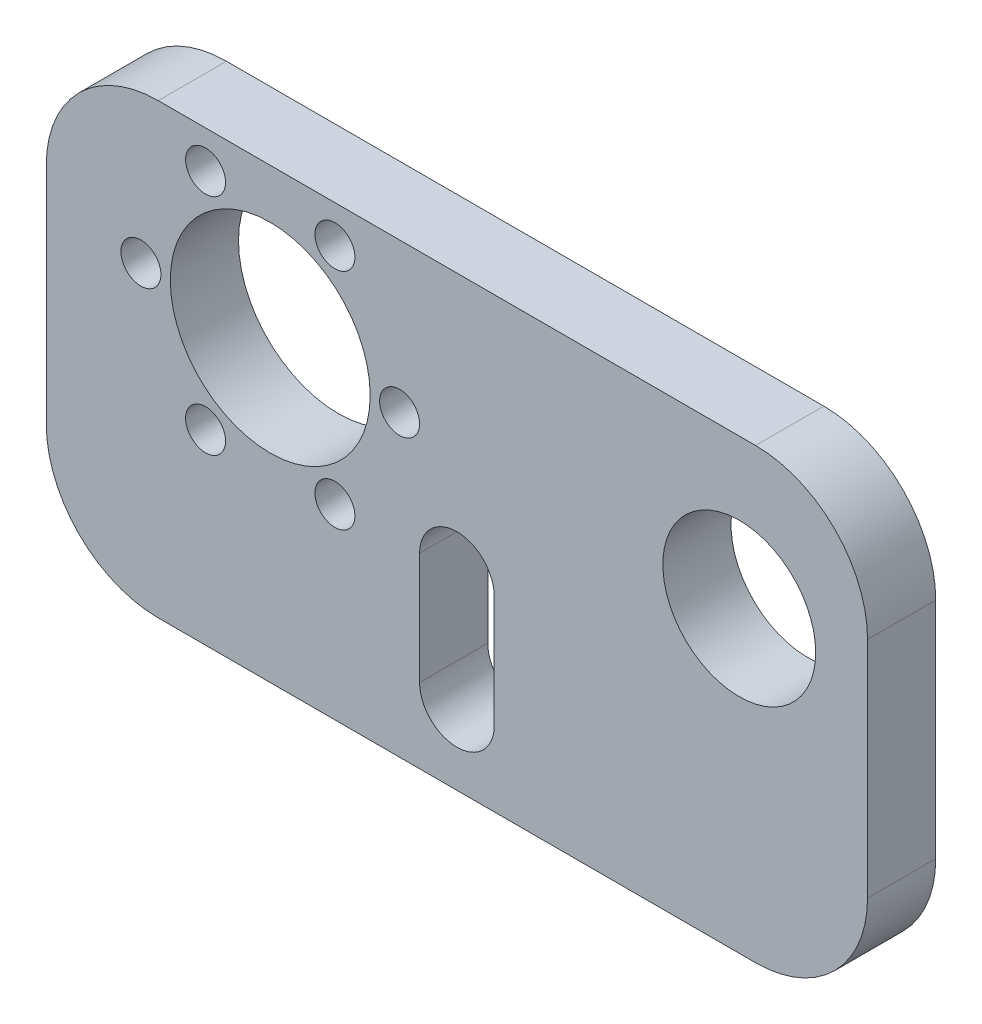
ISO-10303-21;
HEADER;
FILE_DESCRIPTION(('STEP AP214'),'2;1');
FILE_NAME('part.step','',(''),(''),'','','');
FILE_SCHEMA(('AUTOMOTIVE_DESIGN { 1 0 10303 214 1 1 1 1 }'));
ENDSEC;
DATA;
#1=APPLICATION_CONTEXT('core data for automotive mechanical design processes');
#2=APPLICATION_PROTOCOL_DEFINITION('international standard','automotive_design',2000,#1);
#3=PRODUCT_CONTEXT('',#1,'mechanical');
#4=PRODUCT('Part','Part','',(#3));
#5=PRODUCT_RELATED_PRODUCT_CATEGORY('part','',(#4));
#6=PRODUCT_DEFINITION_FORMATION('','',#4);
#7=PRODUCT_DEFINITION_CONTEXT('part definition',#1,'design');
#8=PRODUCT_DEFINITION('design','',#6,#7);
#9=PRODUCT_DEFINITION_SHAPE('','',#8);
#10=(LENGTH_UNIT() NAMED_UNIT(*) SI_UNIT(.MILLI.,.METRE.));
#11=(NAMED_UNIT(*) PLANE_ANGLE_UNIT() SI_UNIT($,.RADIAN.));
#12=(NAMED_UNIT(*) SI_UNIT($,.STERADIAN.) SOLID_ANGLE_UNIT());
#13=UNCERTAINTY_MEASURE_WITH_UNIT(LENGTH_MEASURE(1.E-05),#10,'distance_accuracy_value','');
#14=(GEOMETRIC_REPRESENTATION_CONTEXT(3) GLOBAL_UNCERTAINTY_ASSIGNED_CONTEXT((#13)) GLOBAL_UNIT_ASSIGNED_CONTEXT((#10,
#11,#12)) REPRESENTATION_CONTEXT('',''));
#15=CARTESIAN_POINT('',(0.,0.,0.));
#16=DIRECTION('',(0.,0.,1.));
#17=DIRECTION('',(1.,0.,0.));
#18=AXIS2_PLACEMENT_3D('',#15,#16,#17);
#19=CARTESIAN_POINT('',(0.,0.,0.));
#20=DIRECTION('',(0.,0.,-1.));
#21=DIRECTION('',(-1.,0.,0.));
#22=AXIS2_PLACEMENT_3D('',#19,#20,#21);
#23=PLANE('',#22);
#24=CARTESIAN_POINT('',(34.925,15.875,0.));
#25=DIRECTION('',(0.,0.,1.));
#26=DIRECTION('',(1.,0.,0.));
#27=AXIS2_PLACEMENT_3D('',#24,#25,#26);
#28=CIRCLE('',#27,3.175);
#29=CARTESIAN_POINT('',(38.1,15.875,0.));
#30=VERTEX_POINT('',#29);
#31=CARTESIAN_POINT('',(31.75,15.875,0.));
#32=VERTEX_POINT('',#31);
#33=EDGE_CURVE('E129',#30,#32,#28,.T.);
#34=ORIENTED_EDGE('',*,*,#33,.T.);
#35=DIRECTION('',(0.,-1.,0.));
#36=VECTOR('',#35,1.);
#37=CARTESIAN_POINT('',(31.75,15.875,0.));
#38=LINE('',#37,#36);
#39=CARTESIAN_POINT('',(31.75,6.35,0.));
#40=VERTEX_POINT('',#39);
#41=EDGE_CURVE('E141',#32,#40,#38,.T.);
#42=ORIENTED_EDGE('',*,*,#41,.T.);
#43=CARTESIAN_POINT('',(34.925,6.35,0.));
#44=DIRECTION('',(0.,0.,1.));
#45=DIRECTION('',(1.,0.,0.));
#46=AXIS2_PLACEMENT_3D('',#43,#44,#45);
#47=CIRCLE('',#46,3.175);
#48=CARTESIAN_POINT('',(38.1,6.35,0.));
#49=VERTEX_POINT('',#48);
#50=EDGE_CURVE('E145',#40,#49,#47,.T.);
#51=ORIENTED_EDGE('',*,*,#50,.T.);
#52=DIRECTION('',(0.,1.,0.));
#53=VECTOR('',#52,1.);
#54=CARTESIAN_POINT('',(38.1,15.875,0.));
#55=LINE('',#54,#53);
#56=EDGE_CURVE('E137',#49,#30,#55,.T.);
#57=ORIENTED_EDGE('',*,*,#56,.T.);
#58=EDGE_LOOP('',(#34,#42,#51,#57));
#59=FACE_BOUND('',#58,.T.);
#60=CARTESIAN_POINT('',(24.55,34.9262794416288,0.));
#61=DIRECTION('',(0.,0.,1.));
#62=DIRECTION('',(1.,0.,0.));
#63=AXIS2_PLACEMENT_3D('',#60,#61,#62);
#64=CIRCLE('',#63,1.7);
#65=CARTESIAN_POINT('',(26.25,34.9262794416288,0.));
#66=VERTEX_POINT('',#65);
#67=EDGE_CURVE('E176',#66,#66,#64,.T.);
#68=ORIENTED_EDGE('',*,*,#67,.T.);
#69=EDGE_LOOP('',(#68));
#70=FACE_BOUND('',#69,.T.);
#71=CARTESIAN_POINT('',(13.55,15.8737205583712,0.));
#72=DIRECTION('',(0.,0.,1.));
#73=DIRECTION('',(1.,0.,0.));
#74=AXIS2_PLACEMENT_3D('',#71,#72,#73);
#75=CIRCLE('',#74,1.7);
#76=CARTESIAN_POINT('',(15.25,15.8737205583712,0.));
#77=VERTEX_POINT('',#76);
#78=EDGE_CURVE('E194',#77,#77,#75,.T.);
#79=ORIENTED_EDGE('',*,*,#78,.T.);
#80=EDGE_LOOP('',(#79));
#81=FACE_BOUND('',#80,.T.);
#82=CARTESIAN_POINT('',(24.55,15.8737205583712,0.));
#83=DIRECTION('',(0.,0.,1.));
#84=DIRECTION('',(1.,0.,0.));
#85=AXIS2_PLACEMENT_3D('',#82,#83,#84);
#86=CIRCLE('',#85,1.7);
#87=CARTESIAN_POINT('',(26.25,15.8737205583712,0.));
#88=VERTEX_POINT('',#87);
#89=EDGE_CURVE('E200',#88,#88,#86,.T.);
#90=ORIENTED_EDGE('',*,*,#89,.T.);
#91=EDGE_LOOP('',(#90));
#92=FACE_BOUND('',#91,.T.);
#93=CARTESIAN_POINT('',(58.939787696853,25.4,0.));
#94=DIRECTION('',(0.,0.,1.));
#95=DIRECTION('',(1.,0.,0.));
#96=AXIS2_PLACEMENT_3D('',#93,#94,#95);
#97=CIRCLE('',#96,6.49999999999999);
#98=CARTESIAN_POINT('',(65.4397876968529,25.4,0.));
#99=VERTEX_POINT('',#98);
#100=EDGE_CURVE('E207',#99,#99,#97,.T.);
#101=ORIENTED_EDGE('',*,*,#100,.T.);
#102=EDGE_LOOP('',(#101));
#103=FACE_BOUND('',#102,.T.);
#104=DIRECTION('',(1.,0.,0.));
#105=VECTOR('',#104,1.);
#106=CARTESIAN_POINT('',(69.85,0.,0.));
#107=LINE('',#106,#105);
#108=CARTESIAN_POINT('',(9.525,0.,0.));
#109=VERTEX_POINT('',#108);
#110=CARTESIAN_POINT('',(60.325,0.,0.));
#111=VERTEX_POINT('',#110);
#112=EDGE_CURVE('E213',#109,#111,#107,.T.);
#113=ORIENTED_EDGE('',*,*,#112,.F.);
#114=CARTESIAN_POINT('',(9.525,9.525,0.));
#115=DIRECTION('',(0.,0.,-1.));
#116=DIRECTION('',(-1.,0.,0.));
#117=AXIS2_PLACEMENT_3D('',#114,#115,#116);
#118=CIRCLE('',#117,9.525);
#119=CARTESIAN_POINT('',(0.,9.525,0.));
#120=VERTEX_POINT('',#119);
#121=EDGE_CURVE('E247',#109,#120,#118,.T.);
#122=ORIENTED_EDGE('',*,*,#121,.T.);
#123=DIRECTION('',(0.,-1.,0.));
#124=VECTOR('',#123,1.);
#125=CARTESIAN_POINT('',(0.,0.,0.));
#126=LINE('',#125,#124);
#127=CARTESIAN_POINT('',(0.,28.575,0.));
#128=VERTEX_POINT('',#127);
#129=EDGE_CURVE('E220',#128,#120,#126,.T.);
#130=ORIENTED_EDGE('',*,*,#129,.F.);
#131=CARTESIAN_POINT('',(9.525,28.575,0.));
#132=DIRECTION('',(0.,0.,-1.));
#133=DIRECTION('',(-1.,0.,0.));
#134=AXIS2_PLACEMENT_3D('',#131,#132,#133);
#135=CIRCLE('',#134,9.525);
#136=CARTESIAN_POINT('',(9.525,38.1,0.));
#137=VERTEX_POINT('',#136);
#138=EDGE_CURVE('E241',#128,#137,#135,.T.);
#139=ORIENTED_EDGE('',*,*,#138,.T.);
#140=DIRECTION('',(-1.,0.,0.));
#141=VECTOR('',#140,1.);
#142=CARTESIAN_POINT('',(0.,38.1,0.));
#143=LINE('',#142,#141);
#144=CARTESIAN_POINT('',(60.325,38.1,0.));
#145=VERTEX_POINT('',#144);
#146=EDGE_CURVE('E233',#145,#137,#143,.T.);
#147=ORIENTED_EDGE('',*,*,#146,.F.);
#148=CARTESIAN_POINT('',(60.325,28.575,0.));
#149=DIRECTION('',(0.,0.,-1.));
#150=DIRECTION('',(-1.,0.,0.));
#151=AXIS2_PLACEMENT_3D('',#148,#149,#150);
#152=CIRCLE('',#151,9.525);
#153=CARTESIAN_POINT('',(69.85,28.575,0.));
#154=VERTEX_POINT('',#153);
#155=EDGE_CURVE('E243',#145,#154,#152,.T.);
#156=ORIENTED_EDGE('',*,*,#155,.T.);
#157=DIRECTION('',(0.,1.,0.));
#158=VECTOR('',#157,1.);
#159=CARTESIAN_POINT('',(69.85,38.1,0.));
#160=LINE('',#159,#158);
#161=CARTESIAN_POINT('',(69.85,9.52500000000001,0.));
#162=VERTEX_POINT('',#161);
#163=EDGE_CURVE('E230',#162,#154,#160,.T.);
#164=ORIENTED_EDGE('',*,*,#163,.F.);
#165=CARTESIAN_POINT('',(60.325,9.525,0.));
#166=DIRECTION('',(0.,0.,-1.));
#167=DIRECTION('',(-1.,0.,0.));
#168=AXIS2_PLACEMENT_3D('',#165,#166,#167);
#169=CIRCLE('',#168,9.525);
#170=EDGE_CURVE('E245',#162,#111,#169,.T.);
#171=ORIENTED_EDGE('',*,*,#170,.T.);
#172=EDGE_LOOP('',(#113,#122,#130,#139,#147,#156,#164,#171));
#173=FACE_BOUND('',#172,.T.);
#174=CARTESIAN_POINT('',(19.05,25.4,0.));
#175=DIRECTION('',(0.,0.,1.));
#176=DIRECTION('',(1.,0.,0.));
#177=AXIS2_PLACEMENT_3D('',#174,#175,#176);
#178=CIRCLE('',#177,8.5);
#179=CARTESIAN_POINT('',(27.55,25.4,0.));
#180=VERTEX_POINT('',#179);
#181=EDGE_CURVE('E203',#180,#180,#178,.T.);
#182=ORIENTED_EDGE('',*,*,#181,.T.);
#183=EDGE_LOOP('',(#182));
#184=FACE_BOUND('',#183,.T.);
#185=CARTESIAN_POINT('',(8.05,25.4,0.));
#186=DIRECTION('',(0.,0.,1.));
#187=DIRECTION('',(1.,0.,0.));
#188=AXIS2_PLACEMENT_3D('',#185,#186,#187);
#189=CIRCLE('',#188,1.7);
#190=CARTESIAN_POINT('',(9.74999999999999,25.4,0.));
#191=VERTEX_POINT('',#190);
#192=EDGE_CURVE('E188',#191,#191,#189,.T.);
#193=ORIENTED_EDGE('',*,*,#192,.T.);
#194=EDGE_LOOP('',(#193));
#195=FACE_BOUND('',#194,.T.);
#196=CARTESIAN_POINT('',(13.55,34.9262794416288,0.));
#197=DIRECTION('',(0.,0.,1.));
#198=DIRECTION('',(1.,0.,0.));
#199=AXIS2_PLACEMENT_3D('',#196,#197,#198);
#200=CIRCLE('',#199,1.7);
#201=CARTESIAN_POINT('',(15.25,34.9262794416288,0.));
#202=VERTEX_POINT('',#201);
#203=EDGE_CURVE('E182',#202,#202,#200,.T.);
#204=ORIENTED_EDGE('',*,*,#203,.T.);
#205=EDGE_LOOP('',(#204));
#206=FACE_BOUND('',#205,.T.);
#207=CARTESIAN_POINT('',(30.05,25.4,0.));
#208=DIRECTION('',(0.,0.,1.));
#209=DIRECTION('',(1.,0.,0.));
#210=AXIS2_PLACEMENT_3D('',#207,#208,#209);
#211=CIRCLE('',#210,1.7);
#212=CARTESIAN_POINT('',(31.75,25.4,0.));
#213=VERTEX_POINT('',#212);
#214=EDGE_CURVE('E170',#213,#213,#211,.T.);
#215=ORIENTED_EDGE('',*,*,#214,.T.);
#216=EDGE_LOOP('',(#215));
#217=FACE_BOUND('',#216,.T.);
#218=ADVANCED_FACE('F35',(#59,#70,#81,#92,#103,#173,#184,#195,#206,#217),#23,.T.);
#219=CARTESIAN_POINT('',(0.,0.,5.8));
#220=DIRECTION('',(0.,0.,-1.));
#221=DIRECTION('',(-1.,0.,0.));
#222=AXIS2_PLACEMENT_3D('',#219,#220,#221);
#223=PLANE('',#222);
#224=DIRECTION('',(0.,-1.,0.));
#225=VECTOR('',#224,1.);
#226=CARTESIAN_POINT('',(31.75,15.875,5.8));
#227=LINE('',#226,#225);
#228=CARTESIAN_POINT('',(31.75,15.875,5.8));
#229=VERTEX_POINT('',#228);
#230=CARTESIAN_POINT('',(31.75,6.35,5.8));
#231=VERTEX_POINT('',#230);
#232=EDGE_CURVE('E158',#229,#231,#227,.T.);
#233=ORIENTED_EDGE('',*,*,#232,.F.);
#234=CARTESIAN_POINT('',(34.925,15.875,5.8));
#235=DIRECTION('',(0.,0.,1.));
#236=DIRECTION('',(1.,0.,0.));
#237=AXIS2_PLACEMENT_3D('',#234,#235,#236);
#238=CIRCLE('',#237,3.175);
#239=CARTESIAN_POINT('',(38.1,15.875,5.8));
#240=VERTEX_POINT('',#239);
#241=EDGE_CURVE('E132',#240,#229,#238,.T.);
#242=ORIENTED_EDGE('',*,*,#241,.F.);
#243=DIRECTION('',(0.,1.,0.));
#244=VECTOR('',#243,1.);
#245=CARTESIAN_POINT('',(38.1,15.875,5.8));
#246=LINE('',#245,#244);
#247=CARTESIAN_POINT('',(38.1,6.35,5.8));
#248=VERTEX_POINT('',#247);
#249=EDGE_CURVE('E149',#248,#240,#246,.T.);
#250=ORIENTED_EDGE('',*,*,#249,.F.);
#251=CARTESIAN_POINT('',(34.925,6.35,5.8));
#252=DIRECTION('',(0.,0.,1.));
#253=DIRECTION('',(1.,0.,0.));
#254=AXIS2_PLACEMENT_3D('',#251,#252,#253);
#255=CIRCLE('',#254,3.175);
#256=EDGE_CURVE('E152',#231,#248,#255,.T.);
#257=ORIENTED_EDGE('',*,*,#256,.F.);
#258=EDGE_LOOP('',(#233,#242,#250,#257));
#259=FACE_BOUND('',#258,.T.);
#260=CARTESIAN_POINT('',(30.05,25.4,5.8));
#261=DIRECTION('',(0.,0.,1.));
#262=DIRECTION('',(1.,0.,0.));
#263=AXIS2_PLACEMENT_3D('',#260,#261,#262);
#264=CIRCLE('',#263,1.69999999999999);
#265=CARTESIAN_POINT('',(31.75,25.4,5.8));
#266=VERTEX_POINT('',#265);
#267=EDGE_CURVE('E164',#266,#266,#264,.T.);
#268=ORIENTED_EDGE('',*,*,#267,.F.);
#269=EDGE_LOOP('',(#268));
#270=FACE_BOUND('',#269,.T.);
#271=CARTESIAN_POINT('',(13.55,34.9262794416288,5.8));
#272=DIRECTION('',(0.,0.,1.));
#273=DIRECTION('',(1.,0.,0.));
#274=AXIS2_PLACEMENT_3D('',#271,#272,#273);
#275=CIRCLE('',#274,1.69999999999999);
#276=CARTESIAN_POINT('',(15.25,34.9262794416288,5.8));
#277=VERTEX_POINT('',#276);
#278=EDGE_CURVE('E179',#277,#277,#275,.T.);
#279=ORIENTED_EDGE('',*,*,#278,.F.);
#280=EDGE_LOOP('',(#279));
#281=FACE_BOUND('',#280,.T.);
#282=CARTESIAN_POINT('',(19.05,25.4,5.8));
#283=DIRECTION('',(0.,0.,1.));
#284=DIRECTION('',(1.,0.,0.));
#285=AXIS2_PLACEMENT_3D('',#282,#283,#284);
#286=CIRCLE('',#285,8.5);
#287=CARTESIAN_POINT('',(27.55,25.4,5.8));
#288=VERTEX_POINT('',#287);
#289=EDGE_CURVE('E204',#288,#288,#286,.T.);
#290=ORIENTED_EDGE('',*,*,#289,.F.);
#291=EDGE_LOOP('',(#290));
#292=FACE_BOUND('',#291,.T.);
#293=DIRECTION('',(0.,-1.,0.));
#294=VECTOR('',#293,1.);
#295=CARTESIAN_POINT('',(0.,0.,5.8));
#296=LINE('',#295,#294);
#297=CARTESIAN_POINT('',(0.,28.575,5.8));
#298=VERTEX_POINT('',#297);
#299=CARTESIAN_POINT('',(0.,9.525,5.8));
#300=VERTEX_POINT('',#299);
#301=EDGE_CURVE('E224',#298,#300,#296,.T.);
#302=ORIENTED_EDGE('',*,*,#301,.T.);
#303=CARTESIAN_POINT('',(9.525,9.525,5.8));
#304=DIRECTION('',(0.,0.,-1.));
#305=DIRECTION('',(-1.,0.,0.));
#306=AXIS2_PLACEMENT_3D('',#303,#304,#305);
#307=CIRCLE('',#306,9.525);
#308=CARTESIAN_POINT('',(9.525,0.,5.8));
#309=VERTEX_POINT('',#308);
#310=EDGE_CURVE('E259',#300,#309,#307,.F.);
#311=ORIENTED_EDGE('',*,*,#310,.T.);
#312=DIRECTION('',(1.,0.,0.));
#313=VECTOR('',#312,1.);
#314=CARTESIAN_POINT('',(69.85,0.,5.8));
#315=LINE('',#314,#313);
#316=CARTESIAN_POINT('',(60.325,0.,5.8));
#317=VERTEX_POINT('',#316);
#318=EDGE_CURVE('E216',#309,#317,#315,.T.);
#319=ORIENTED_EDGE('',*,*,#318,.T.);
#320=CARTESIAN_POINT('',(60.325,9.525,5.8));
#321=DIRECTION('',(0.,0.,-1.));
#322=DIRECTION('',(-1.,0.,0.));
#323=AXIS2_PLACEMENT_3D('',#320,#321,#322);
#324=CIRCLE('',#323,9.525);
#325=CARTESIAN_POINT('',(69.85,9.52500000000001,5.8));
#326=VERTEX_POINT('',#325);
#327=EDGE_CURVE('E257',#317,#326,#324,.F.);
#328=ORIENTED_EDGE('',*,*,#327,.T.);
#329=DIRECTION('',(0.,1.,0.));
#330=VECTOR('',#329,1.);
#331=CARTESIAN_POINT('',(69.85,38.1,5.8));
#332=LINE('',#331,#330);
#333=CARTESIAN_POINT('',(69.85,28.575,5.8));
#334=VERTEX_POINT('',#333);
#335=EDGE_CURVE('E219',#326,#334,#332,.T.);
#336=ORIENTED_EDGE('',*,*,#335,.T.);
#337=CARTESIAN_POINT('',(60.325,28.575,5.8));
#338=DIRECTION('',(0.,0.,-1.));
#339=DIRECTION('',(-1.,0.,0.));
#340=AXIS2_PLACEMENT_3D('',#337,#338,#339);
#341=CIRCLE('',#340,9.525);
#342=CARTESIAN_POINT('',(60.325,38.1,5.8));
#343=VERTEX_POINT('',#342);
#344=EDGE_CURVE('E56',#334,#343,#341,.F.);
#345=ORIENTED_EDGE('',*,*,#344,.T.);
#346=DIRECTION('',(-1.,0.,0.));
#347=VECTOR('',#346,1.);
#348=CARTESIAN_POINT('',(0.,38.1,5.8));
#349=LINE('',#348,#347);
#350=CARTESIAN_POINT('',(9.525,38.1,5.8));
#351=VERTEX_POINT('',#350);
#352=EDGE_CURVE('E222',#343,#351,#349,.T.);
#353=ORIENTED_EDGE('',*,*,#352,.T.);
#354=CARTESIAN_POINT('',(9.525,28.575,5.8));
#355=DIRECTION('',(0.,0.,-1.));
#356=DIRECTION('',(-1.,0.,0.));
#357=AXIS2_PLACEMENT_3D('',#354,#355,#356);
#358=CIRCLE('',#357,9.525);
#359=EDGE_CURVE('E254',#351,#298,#358,.F.);
#360=ORIENTED_EDGE('',*,*,#359,.T.);
#361=EDGE_LOOP('',(#302,#311,#319,#328,#336,#345,#353,#360));
#362=FACE_BOUND('',#361,.T.);
#363=CARTESIAN_POINT('',(58.939787696853,25.4,5.8));
#364=DIRECTION('',(0.,0.,1.));
#365=DIRECTION('',(1.,0.,0.));
#366=AXIS2_PLACEMENT_3D('',#363,#364,#365);
#367=CIRCLE('',#366,6.49999999999999);
#368=CARTESIAN_POINT('',(65.4397876968529,25.4,5.8));
#369=VERTEX_POINT('',#368);
#370=EDGE_CURVE('E210',#369,#369,#367,.T.);
#371=ORIENTED_EDGE('',*,*,#370,.F.);
#372=EDGE_LOOP('',(#371));
#373=FACE_BOUND('',#372,.T.);
#374=CARTESIAN_POINT('',(24.55,15.8737205583712,5.8));
#375=DIRECTION('',(0.,0.,1.));
#376=DIRECTION('',(1.,0.,0.));
#377=AXIS2_PLACEMENT_3D('',#374,#375,#376);
#378=CIRCLE('',#377,1.69999999999999);
#379=CARTESIAN_POINT('',(26.25,15.8737205583712,5.8));
#380=VERTEX_POINT('',#379);
#381=EDGE_CURVE('E197',#380,#380,#378,.T.);
#382=ORIENTED_EDGE('',*,*,#381,.F.);
#383=EDGE_LOOP('',(#382));
#384=FACE_BOUND('',#383,.T.);
#385=CARTESIAN_POINT('',(13.55,15.8737205583712,5.8));
#386=DIRECTION('',(0.,0.,1.));
#387=DIRECTION('',(1.,0.,0.));
#388=AXIS2_PLACEMENT_3D('',#385,#386,#387);
#389=CIRCLE('',#388,1.69999999999999);
#390=CARTESIAN_POINT('',(15.25,15.8737205583712,5.8));
#391=VERTEX_POINT('',#390);
#392=EDGE_CURVE('E191',#391,#391,#389,.T.);
#393=ORIENTED_EDGE('',*,*,#392,.F.);
#394=EDGE_LOOP('',(#393));
#395=FACE_BOUND('',#394,.T.);
#396=CARTESIAN_POINT('',(8.05,25.4,5.8));
#397=DIRECTION('',(0.,0.,1.));
#398=DIRECTION('',(1.,0.,0.));
#399=AXIS2_PLACEMENT_3D('',#396,#397,#398);
#400=CIRCLE('',#399,1.69999999999999);
#401=CARTESIAN_POINT('',(9.74999999999998,25.4,5.8));
#402=VERTEX_POINT('',#401);
#403=EDGE_CURVE('E185',#402,#402,#400,.T.);
#404=ORIENTED_EDGE('',*,*,#403,.F.);
#405=EDGE_LOOP('',(#404));
#406=FACE_BOUND('',#405,.T.);
#407=CARTESIAN_POINT('',(24.55,34.9262794416288,5.8));
#408=DIRECTION('',(0.,0.,1.));
#409=DIRECTION('',(1.,0.,0.));
#410=AXIS2_PLACEMENT_3D('',#407,#408,#409);
#411=CIRCLE('',#410,1.69999999999999);
#412=CARTESIAN_POINT('',(26.25,34.9262794416288,5.8));
#413=VERTEX_POINT('',#412);
#414=EDGE_CURVE('E173',#413,#413,#411,.T.);
#415=ORIENTED_EDGE('',*,*,#414,.F.);
#416=EDGE_LOOP('',(#415));
#417=FACE_BOUND('',#416,.T.);
#418=ADVANCED_FACE('F282',(#259,#270,#281,#292,#362,#373,#384,#395,#406,#417),#223,.F.);
#419=CARTESIAN_POINT('',(69.85,0.,5.8));
#420=DIRECTION('',(0.,1.,0.));
#421=DIRECTION('',(0.,0.,1.));
#422=AXIS2_PLACEMENT_3D('',#419,#420,#421);
#423=PLANE('',#422);
#424=ORIENTED_EDGE('',*,*,#318,.F.);
#425=DIRECTION('',(0.,0.,-1.));
#426=VECTOR('',#425,1.);
#427=CARTESIAN_POINT('',(9.525,0.,5.8));
#428=LINE('',#427,#426);
#429=EDGE_CURVE('E238',#309,#109,#428,.T.);
#430=ORIENTED_EDGE('',*,*,#429,.T.);
#431=ORIENTED_EDGE('',*,*,#112,.T.);
#432=DIRECTION('',(0.,0.,-1.));
#433=VECTOR('',#432,1.);
#434=CARTESIAN_POINT('',(60.325,0.,5.8));
#435=LINE('',#434,#433);
#436=EDGE_CURVE('E227',#111,#317,#435,.F.);
#437=ORIENTED_EDGE('',*,*,#436,.T.);
#438=EDGE_LOOP('',(#424,#430,#431,#437));
#439=FACE_BOUND('',#438,.T.);
#440=ADVANCED_FACE('F297',(#439),#423,.F.);
#441=CARTESIAN_POINT('',(69.85,38.1,5.8));
#442=DIRECTION('',(-1.,0.,0.));
#443=DIRECTION('',(0.,0.,1.));
#444=AXIS2_PLACEMENT_3D('',#441,#442,#443);
#445=PLANE('',#444);
#446=ORIENTED_EDGE('',*,*,#335,.F.);
#447=DIRECTION('',(0.,0.,-1.));
#448=VECTOR('',#447,1.);
#449=CARTESIAN_POINT('',(69.85,9.525,5.8));
#450=LINE('',#449,#448);
#451=EDGE_CURVE('E263',#326,#162,#450,.T.);
#452=ORIENTED_EDGE('',*,*,#451,.T.);
#453=ORIENTED_EDGE('',*,*,#163,.T.);
#454=DIRECTION('',(0.,0.,-1.));
#455=VECTOR('',#454,1.);
#456=CARTESIAN_POINT('',(69.85,28.575,5.8));
#457=LINE('',#456,#455);
#458=EDGE_CURVE('E261',#154,#334,#457,.F.);
#459=ORIENTED_EDGE('',*,*,#458,.T.);
#460=EDGE_LOOP('',(#446,#452,#453,#459));
#461=FACE_BOUND('',#460,.T.);
#462=ADVANCED_FACE('F269',(#461),#445,.F.);
#463=CARTESIAN_POINT('',(0.,38.1,5.8));
#464=DIRECTION('',(0.,-1.,0.));
#465=DIRECTION('',(0.,0.,-1.));
#466=AXIS2_PLACEMENT_3D('',#463,#464,#465);
#467=PLANE('',#466);
#468=ORIENTED_EDGE('',*,*,#352,.F.);
#469=DIRECTION('',(0.,0.,-1.));
#470=VECTOR('',#469,1.);
#471=CARTESIAN_POINT('',(60.325,38.1,5.8));
#472=LINE('',#471,#470);
#473=EDGE_CURVE('E11',#343,#145,#472,.T.);
#474=ORIENTED_EDGE('',*,*,#473,.T.);
#475=ORIENTED_EDGE('',*,*,#146,.T.);
#476=DIRECTION('',(0.,0.,-1.));
#477=VECTOR('',#476,1.);
#478=CARTESIAN_POINT('',(9.525,38.1,5.8));
#479=LINE('',#478,#477);
#480=EDGE_CURVE('E43',#137,#351,#479,.F.);
#481=ORIENTED_EDGE('',*,*,#480,.T.);
#482=EDGE_LOOP('',(#468,#474,#475,#481));
#483=FACE_BOUND('',#482,.T.);
#484=ADVANCED_FACE('F280',(#483),#467,.F.);
#485=CARTESIAN_POINT('',(0.,0.,5.8));
#486=DIRECTION('',(1.,0.,0.));
#487=DIRECTION('',(0.,0.,-1.));
#488=AXIS2_PLACEMENT_3D('',#485,#486,#487);
#489=PLANE('',#488);
#490=ORIENTED_EDGE('',*,*,#129,.T.);
#491=DIRECTION('',(0.,0.,-1.));
#492=VECTOR('',#491,1.);
#493=CARTESIAN_POINT('',(0.,9.525,5.8));
#494=LINE('',#493,#492);
#495=EDGE_CURVE('E252',#120,#300,#494,.F.);
#496=ORIENTED_EDGE('',*,*,#495,.T.);
#497=ORIENTED_EDGE('',*,*,#301,.F.);
#498=DIRECTION('',(0.,0.,-1.));
#499=VECTOR('',#498,1.);
#500=CARTESIAN_POINT('',(0.,28.575,5.8));
#501=LINE('',#500,#499);
#502=EDGE_CURVE('E249',#298,#128,#501,.T.);
#503=ORIENTED_EDGE('',*,*,#502,.T.);
#504=EDGE_LOOP('',(#490,#496,#497,#503));
#505=FACE_BOUND('',#504,.T.);
#506=ADVANCED_FACE('F289',(#505),#489,.F.);
#507=CARTESIAN_POINT('',(58.939787696853,25.4,5.8));
#508=DIRECTION('',(0.,0.,-1.));
#509=DIRECTION('',(-1.,0.,0.));
#510=AXIS2_PLACEMENT_3D('',#507,#508,#509);
#511=CYLINDRICAL_SURFACE('',#510,6.49999999999999);
#512=ORIENTED_EDGE('',*,*,#370,.T.);
#513=EDGE_LOOP('',(#512));
#514=FACE_BOUND('',#513,.T.);
#515=ORIENTED_EDGE('',*,*,#100,.F.);
#516=EDGE_LOOP('',(#515));
#517=FACE_BOUND('',#516,.T.);
#518=ADVANCED_FACE('F318',(#514,#517),#511,.F.);
#519=CARTESIAN_POINT('',(19.05,25.4,5.8));
#520=DIRECTION('',(0.,0.,-1.));
#521=DIRECTION('',(-1.,0.,0.));
#522=AXIS2_PLACEMENT_3D('',#519,#520,#521);
#523=CYLINDRICAL_SURFACE('',#522,8.5);
#524=ORIENTED_EDGE('',*,*,#289,.T.);
#525=EDGE_LOOP('',(#524));
#526=FACE_BOUND('',#525,.T.);
#527=ORIENTED_EDGE('',*,*,#181,.F.);
#528=EDGE_LOOP('',(#527));
#529=FACE_BOUND('',#528,.T.);
#530=ADVANCED_FACE('F347',(#526,#529),#523,.F.);
#531=CARTESIAN_POINT('',(24.55,15.8737205583712,5.8));
#532=DIRECTION('',(0.,0.,1.));
#533=DIRECTION('',(1.,0.,0.));
#534=AXIS2_PLACEMENT_3D('',#531,#532,#533);
#535=CYLINDRICAL_SURFACE('',#534,1.69999999999999);
#536=ORIENTED_EDGE('',*,*,#89,.F.);
#537=EDGE_LOOP('',(#536));
#538=FACE_BOUND('',#537,.T.);
#539=ORIENTED_EDGE('',*,*,#381,.T.);
#540=EDGE_LOOP('',(#539));
#541=FACE_BOUND('',#540,.T.);
#542=ADVANCED_FACE('F354',(#538,#541),#535,.F.);
#543=CARTESIAN_POINT('',(13.55,15.8737205583712,5.8));
#544=DIRECTION('',(0.,0.,1.));
#545=DIRECTION('',(1.,0.,0.));
#546=AXIS2_PLACEMENT_3D('',#543,#544,#545);
#547=CYLINDRICAL_SURFACE('',#546,1.69999999999999);
#548=ORIENTED_EDGE('',*,*,#78,.F.);
#549=EDGE_LOOP('',(#548));
#550=FACE_BOUND('',#549,.T.);
#551=ORIENTED_EDGE('',*,*,#392,.T.);
#552=EDGE_LOOP('',(#551));
#553=FACE_BOUND('',#552,.T.);
#554=ADVANCED_FACE('F362',(#550,#553),#547,.F.);
#555=CARTESIAN_POINT('',(8.05,25.4,5.8));
#556=DIRECTION('',(0.,0.,1.));
#557=DIRECTION('',(1.,0.,0.));
#558=AXIS2_PLACEMENT_3D('',#555,#556,#557);
#559=CYLINDRICAL_SURFACE('',#558,1.69999999999999);
#560=ORIENTED_EDGE('',*,*,#192,.F.);
#561=EDGE_LOOP('',(#560));
#562=FACE_BOUND('',#561,.T.);
#563=ORIENTED_EDGE('',*,*,#403,.T.);
#564=EDGE_LOOP('',(#563));
#565=FACE_BOUND('',#564,.T.);
#566=ADVANCED_FACE('F370',(#562,#565),#559,.F.);
#567=CARTESIAN_POINT('',(13.55,34.9262794416288,5.8));
#568=DIRECTION('',(0.,0.,1.));
#569=DIRECTION('',(1.,0.,0.));
#570=AXIS2_PLACEMENT_3D('',#567,#568,#569);
#571=CYLINDRICAL_SURFACE('',#570,1.69999999999999);
#572=ORIENTED_EDGE('',*,*,#203,.F.);
#573=EDGE_LOOP('',(#572));
#574=FACE_BOUND('',#573,.T.);
#575=ORIENTED_EDGE('',*,*,#278,.T.);
#576=EDGE_LOOP('',(#575));
#577=FACE_BOUND('',#576,.T.);
#578=ADVANCED_FACE('F378',(#574,#577),#571,.F.);
#579=CARTESIAN_POINT('',(24.55,34.9262794416288,5.8));
#580=DIRECTION('',(0.,0.,1.));
#581=DIRECTION('',(1.,0.,0.));
#582=AXIS2_PLACEMENT_3D('',#579,#580,#581);
#583=CYLINDRICAL_SURFACE('',#582,1.69999999999999);
#584=ORIENTED_EDGE('',*,*,#67,.F.);
#585=EDGE_LOOP('',(#584));
#586=FACE_BOUND('',#585,.T.);
#587=ORIENTED_EDGE('',*,*,#414,.T.);
#588=EDGE_LOOP('',(#587));
#589=FACE_BOUND('',#588,.T.);
#590=ADVANCED_FACE('F386',(#586,#589),#583,.F.);
#591=CARTESIAN_POINT('',(30.05,25.4,5.8));
#592=DIRECTION('',(0.,0.,1.));
#593=DIRECTION('',(1.,0.,0.));
#594=AXIS2_PLACEMENT_3D('',#591,#592,#593);
#595=CYLINDRICAL_SURFACE('',#594,1.69999999999999);
#596=ORIENTED_EDGE('',*,*,#214,.F.);
#597=EDGE_LOOP('',(#596));
#598=FACE_BOUND('',#597,.T.);
#599=ORIENTED_EDGE('',*,*,#267,.T.);
#600=EDGE_LOOP('',(#599));
#601=FACE_BOUND('',#600,.T.);
#602=ADVANCED_FACE('F394',(#598,#601),#595,.F.);
#603=CARTESIAN_POINT('',(34.925,15.875,0.));
#604=DIRECTION('',(0.,0.,1.));
#605=DIRECTION('',(1.,0.,0.));
#606=AXIS2_PLACEMENT_3D('',#603,#604,#605);
#607=CYLINDRICAL_SURFACE('',#606,3.175);
#608=ORIENTED_EDGE('',*,*,#241,.T.);
#609=DIRECTION('',(0.,0.,1.));
#610=VECTOR('',#609,1.);
#611=CARTESIAN_POINT('',(31.75,15.875,0.));
#612=LINE('',#611,#610);
#613=EDGE_CURVE('E125',#32,#229,#612,.T.);
#614=ORIENTED_EDGE('',*,*,#613,.F.);
#615=ORIENTED_EDGE('',*,*,#33,.F.);
#616=DIRECTION('',(0.,0.,1.));
#617=VECTOR('',#616,1.);
#618=CARTESIAN_POINT('',(38.1,15.875,0.));
#619=LINE('',#618,#617);
#620=EDGE_CURVE('E162',#30,#240,#619,.T.);
#621=ORIENTED_EDGE('',*,*,#620,.T.);
#622=EDGE_LOOP('',(#608,#614,#615,#621));
#623=FACE_BOUND('',#622,.T.);
#624=ADVANCED_FACE('F127',(#623),#607,.F.);
#625=CARTESIAN_POINT('',(38.1,15.875,0.));
#626=DIRECTION('',(1.,0.,0.));
#627=DIRECTION('',(0.,0.,-1.));
#628=AXIS2_PLACEMENT_3D('',#625,#626,#627);
#629=PLANE('',#628);
#630=ORIENTED_EDGE('',*,*,#249,.T.);
#631=ORIENTED_EDGE('',*,*,#620,.F.);
#632=ORIENTED_EDGE('',*,*,#56,.F.);
#633=DIRECTION('',(0.,0.,1.));
#634=VECTOR('',#633,1.);
#635=CARTESIAN_POINT('',(38.1,6.35,0.));
#636=LINE('',#635,#634);
#637=EDGE_CURVE('E165',#49,#248,#636,.T.);
#638=ORIENTED_EDGE('',*,*,#637,.T.);
#639=EDGE_LOOP('',(#630,#631,#632,#638));
#640=FACE_BOUND('',#639,.T.);
#641=ADVANCED_FACE('F409',(#640),#629,.F.);
#642=CARTESIAN_POINT('',(34.925,6.35,0.));
#643=DIRECTION('',(0.,0.,1.));
#644=DIRECTION('',(1.,0.,0.));
#645=AXIS2_PLACEMENT_3D('',#642,#643,#644);
#646=CYLINDRICAL_SURFACE('',#645,3.175);
#647=ORIENTED_EDGE('',*,*,#256,.T.);
#648=ORIENTED_EDGE('',*,*,#637,.F.);
#649=ORIENTED_EDGE('',*,*,#50,.F.);
#650=DIRECTION('',(0.,0.,1.));
#651=VECTOR('',#650,1.);
#652=CARTESIAN_POINT('',(31.75,6.35,0.));
#653=LINE('',#652,#651);
#654=EDGE_CURVE('E136',#40,#231,#653,.T.);
#655=ORIENTED_EDGE('',*,*,#654,.T.);
#656=EDGE_LOOP('',(#647,#648,#649,#655));
#657=FACE_BOUND('',#656,.T.);
#658=ADVANCED_FACE('F416',(#657),#646,.F.);
#659=CARTESIAN_POINT('',(31.75,15.875,0.));
#660=DIRECTION('',(-1.,0.,0.));
#661=DIRECTION('',(0.,0.,1.));
#662=AXIS2_PLACEMENT_3D('',#659,#660,#661);
#663=PLANE('',#662);
#664=ORIENTED_EDGE('',*,*,#232,.T.);
#665=ORIENTED_EDGE('',*,*,#654,.F.);
#666=ORIENTED_EDGE('',*,*,#41,.F.);
#667=ORIENTED_EDGE('',*,*,#613,.T.);
#668=EDGE_LOOP('',(#664,#665,#666,#667));
#669=FACE_BOUND('',#668,.T.);
#670=ADVANCED_FACE('F142',(#669),#663,.F.);
#671=CARTESIAN_POINT('',(9.525,9.525,5.8));
#672=DIRECTION('',(0.,0.,-1.));
#673=DIRECTION('',(-1.,0.,0.));
#674=AXIS2_PLACEMENT_3D('',#671,#672,#673);
#675=CYLINDRICAL_SURFACE('',#674,9.525);
#676=ORIENTED_EDGE('',*,*,#310,.F.);
#677=ORIENTED_EDGE('',*,*,#495,.F.);
#678=ORIENTED_EDGE('',*,*,#121,.F.);
#679=ORIENTED_EDGE('',*,*,#429,.F.);
#680=EDGE_LOOP('',(#676,#677,#678,#679));
#681=FACE_BOUND('',#680,.T.);
#682=ADVANCED_FACE('F294',(#681),#675,.T.);
#683=CARTESIAN_POINT('',(60.325,9.525,5.8));
#684=DIRECTION('',(0.,0.,-1.));
#685=DIRECTION('',(-1.,0.,0.));
#686=AXIS2_PLACEMENT_3D('',#683,#684,#685);
#687=CYLINDRICAL_SURFACE('',#686,9.525);
#688=ORIENTED_EDGE('',*,*,#327,.F.);
#689=ORIENTED_EDGE('',*,*,#436,.F.);
#690=ORIENTED_EDGE('',*,*,#170,.F.);
#691=ORIENTED_EDGE('',*,*,#451,.F.);
#692=EDGE_LOOP('',(#688,#689,#690,#691));
#693=FACE_BOUND('',#692,.T.);
#694=ADVANCED_FACE('F299',(#693),#687,.T.);
#695=CARTESIAN_POINT('',(60.325,28.575,5.8));
#696=DIRECTION('',(0.,0.,-1.));
#697=DIRECTION('',(-1.,0.,0.));
#698=AXIS2_PLACEMENT_3D('',#695,#696,#697);
#699=CYLINDRICAL_SURFACE('',#698,9.525);
#700=ORIENTED_EDGE('',*,*,#344,.F.);
#701=ORIENTED_EDGE('',*,*,#458,.F.);
#702=ORIENTED_EDGE('',*,*,#155,.F.);
#703=ORIENTED_EDGE('',*,*,#473,.F.);
#704=EDGE_LOOP('',(#700,#701,#702,#703));
#705=FACE_BOUND('',#704,.T.);
#706=ADVANCED_FACE('F279',(#705),#699,.T.);
#707=CARTESIAN_POINT('',(9.525,28.575,5.8));
#708=DIRECTION('',(0.,0.,-1.));
#709=DIRECTION('',(-1.,0.,0.));
#710=AXIS2_PLACEMENT_3D('',#707,#708,#709);
#711=CYLINDRICAL_SURFACE('',#710,9.525);
#712=ORIENTED_EDGE('',*,*,#359,.F.);
#713=ORIENTED_EDGE('',*,*,#480,.F.);
#714=ORIENTED_EDGE('',*,*,#138,.F.);
#715=ORIENTED_EDGE('',*,*,#502,.F.);
#716=EDGE_LOOP('',(#712,#713,#714,#715));
#717=FACE_BOUND('',#716,.T.);
#718=ADVANCED_FACE('F37',(#717),#711,.T.);
#719=CLOSED_SHELL('',(#218,#418,#440,#462,#484,#506,#518,#530,#542,#554,#566,#578,#590,#602,
#624,#641,#658,#670,#682,#694,#706,#718));
#720=MANIFOLD_SOLID_BREP('B2',#719);
#721=ADVANCED_BREP_SHAPE_REPRESENTATION('',(#18,#720),#14);
#722=SHAPE_DEFINITION_REPRESENTATION(#9,#721);
ENDSEC;
END-ISO-10303-21;
